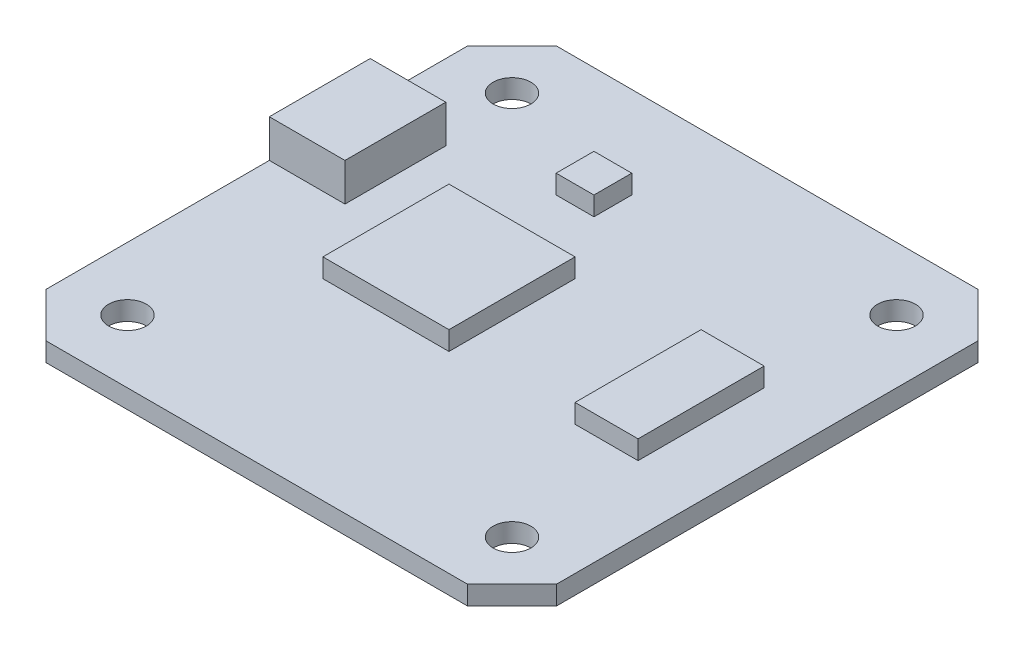
ISO-10303-21;
HEADER;
FILE_DESCRIPTION(('STEP AP214'),'2;1');
FILE_NAME('part.step','',(''),(''),'','','');
FILE_SCHEMA(('AUTOMOTIVE_DESIGN { 1 0 10303 214 1 1 1 1 }'));
ENDSEC;
DATA;
#1=APPLICATION_CONTEXT('core data for automotive mechanical design processes');
#2=APPLICATION_PROTOCOL_DEFINITION('international standard','automotive_design',2000,#1);
#3=PRODUCT_CONTEXT('',#1,'mechanical');
#4=PRODUCT('Part','Part','',(#3));
#5=PRODUCT_RELATED_PRODUCT_CATEGORY('part','',(#4));
#6=PRODUCT_DEFINITION_FORMATION('','',#4);
#7=PRODUCT_DEFINITION_CONTEXT('part definition',#1,'design');
#8=PRODUCT_DEFINITION('design','',#6,#7);
#9=PRODUCT_DEFINITION_SHAPE('','',#8);
#10=(LENGTH_UNIT() NAMED_UNIT(*) SI_UNIT(.MILLI.,.METRE.));
#11=(NAMED_UNIT(*) PLANE_ANGLE_UNIT() SI_UNIT($,.RADIAN.));
#12=(NAMED_UNIT(*) SI_UNIT($,.STERADIAN.) SOLID_ANGLE_UNIT());
#13=UNCERTAINTY_MEASURE_WITH_UNIT(LENGTH_MEASURE(1.E-05),#10,'distance_accuracy_value','');
#14=(GEOMETRIC_REPRESENTATION_CONTEXT(3) GLOBAL_UNCERTAINTY_ASSIGNED_CONTEXT((#13)) GLOBAL_UNIT_ASSIGNED_CONTEXT((#10,
#11,#12)) REPRESENTATION_CONTEXT('',''));
#15=CARTESIAN_POINT('',(0.,0.,0.));
#16=DIRECTION('',(0.,0.,1.));
#17=DIRECTION('',(1.,0.,0.));
#18=AXIS2_PLACEMENT_3D('',#15,#16,#17);
#19=CARTESIAN_POINT('',(0.,1.5,0.));
#20=DIRECTION('',(0.,1.,0.));
#21=DIRECTION('',(0.,0.,1.));
#22=AXIS2_PLACEMENT_3D('',#19,#20,#21);
#23=PLANE('',#22);
#24=CARTESIAN_POINT('',(15.25,1.5,15.25));
#25=DIRECTION('',(0.,1.,0.));
#26=DIRECTION('',(0.,0.,-1.));
#27=AXIS2_PLACEMENT_3D('',#24,#25,#26);
#28=CIRCLE('',#27,1.5);
#29=CARTESIAN_POINT('',(15.25,1.5,13.75));
#30=VERTEX_POINT('',#29);
#31=EDGE_CURVE('E315',#30,#30,#28,.T.);
#32=ORIENTED_EDGE('',*,*,#31,.F.);
#33=EDGE_LOOP('',(#32));
#34=FACE_BOUND('',#33,.T.);
#35=CARTESIAN_POINT('',(-15.25,1.5,-15.25));
#36=DIRECTION('',(0.,1.,0.));
#37=DIRECTION('',(0.,0.,1.));
#38=AXIS2_PLACEMENT_3D('',#35,#36,#37);
#39=CIRCLE('',#38,1.5);
#40=CARTESIAN_POINT('',(-15.25,1.5,-13.75));
#41=VERTEX_POINT('',#40);
#42=EDGE_CURVE('E327',#41,#41,#39,.T.);
#43=ORIENTED_EDGE('',*,*,#42,.F.);
#44=EDGE_LOOP('',(#43));
#45=FACE_BOUND('',#44,.T.);
#46=CARTESIAN_POINT('',(-15.25,1.5,15.25));
#47=DIRECTION('',(0.,1.,0.));
#48=DIRECTION('',(0.,0.,1.));
#49=AXIS2_PLACEMENT_3D('',#46,#47,#48);
#50=CIRCLE('',#49,1.5);
#51=CARTESIAN_POINT('',(-15.25,1.5,16.75));
#52=VERTEX_POINT('',#51);
#53=EDGE_CURVE('E321',#52,#52,#50,.T.);
#54=ORIENTED_EDGE('',*,*,#53,.F.);
#55=EDGE_LOOP('',(#54));
#56=FACE_BOUND('',#55,.T.);
#57=CARTESIAN_POINT('',(15.25,1.5,-15.25));
#58=DIRECTION('',(0.,1.,0.));
#59=DIRECTION('',(0.,0.,-1.));
#60=AXIS2_PLACEMENT_3D('',#57,#58,#59);
#61=CIRCLE('',#60,1.5);
#62=CARTESIAN_POINT('',(15.25,1.5,-16.75));
#63=VERTEX_POINT('',#62);
#64=EDGE_CURVE('E309',#63,#63,#61,.T.);
#65=ORIENTED_EDGE('',*,*,#64,.F.);
#66=EDGE_LOOP('',(#65));
#67=FACE_BOUND('',#66,.T.);
#68=DIRECTION('',(1.,0.,0.));
#69=VECTOR('',#68,1.);
#70=CARTESIAN_POINT('',(-10.,1.5,5.));
#71=LINE('',#70,#69);
#72=CARTESIAN_POINT('',(-10.,1.5,5.));
#73=VERTEX_POINT('',#72);
#74=CARTESIAN_POINT('',(0.,1.5,5.));
#75=VERTEX_POINT('',#74);
#76=EDGE_CURVE('E293',#73,#75,#71,.T.);
#77=ORIENTED_EDGE('',*,*,#76,.F.);
#78=DIRECTION('',(0.,0.,1.));
#79=VECTOR('',#78,1.);
#80=CARTESIAN_POINT('',(-10.,1.5,-5.));
#81=LINE('',#80,#79);
#82=CARTESIAN_POINT('',(-10.,1.5,-5.));
#83=VERTEX_POINT('',#82);
#84=EDGE_CURVE('E279',#83,#73,#81,.T.);
#85=ORIENTED_EDGE('',*,*,#84,.F.);
#86=DIRECTION('',(-1.,0.,0.));
#87=VECTOR('',#86,1.);
#88=CARTESIAN_POINT('',(-10.,1.5,-5.));
#89=LINE('',#88,#87);
#90=CARTESIAN_POINT('',(0.,1.5,-5.));
#91=VERTEX_POINT('',#90);
#92=EDGE_CURVE('E284',#91,#83,#89,.T.);
#93=ORIENTED_EDGE('',*,*,#92,.F.);
#94=DIRECTION('',(0.,0.,-1.));
#95=VECTOR('',#94,1.);
#96=CARTESIAN_POINT('',(0.,1.5,-5.));
#97=LINE('',#96,#95);
#98=EDGE_CURVE('E295',#75,#91,#97,.T.);
#99=ORIENTED_EDGE('',*,*,#98,.F.);
#100=EDGE_LOOP('',(#77,#85,#93,#99));
#101=FACE_BOUND('',#100,.T.);
#102=DIRECTION('',(1.,0.,0.));
#103=VECTOR('',#102,1.);
#104=CARTESIAN_POINT('',(10.,1.5,5.));
#105=LINE('',#104,#103);
#106=CARTESIAN_POINT('',(10.,1.5,5.));
#107=VERTEX_POINT('',#106);
#108=CARTESIAN_POINT('',(15.,1.5,5.));
#109=VERTEX_POINT('',#108);
#110=EDGE_CURVE('E264',#107,#109,#105,.T.);
#111=ORIENTED_EDGE('',*,*,#110,.F.);
#112=DIRECTION('',(0.,0.,1.));
#113=VECTOR('',#112,1.);
#114=CARTESIAN_POINT('',(10.,1.5,-5.));
#115=LINE('',#114,#113);
#116=CARTESIAN_POINT('',(10.,1.5,-5.));
#117=VERTEX_POINT('',#116);
#118=EDGE_CURVE('E250',#117,#107,#115,.T.);
#119=ORIENTED_EDGE('',*,*,#118,.F.);
#120=DIRECTION('',(-1.,0.,0.));
#121=VECTOR('',#120,1.);
#122=CARTESIAN_POINT('',(10.,1.5,-5.));
#123=LINE('',#122,#121);
#124=CARTESIAN_POINT('',(15.,1.5,-5.));
#125=VERTEX_POINT('',#124);
#126=EDGE_CURVE('E255',#125,#117,#123,.T.);
#127=ORIENTED_EDGE('',*,*,#126,.F.);
#128=DIRECTION('',(0.,0.,-1.));
#129=VECTOR('',#128,1.);
#130=CARTESIAN_POINT('',(15.,1.5,-5.));
#131=LINE('',#130,#129);
#132=EDGE_CURVE('E266',#109,#125,#131,.T.);
#133=ORIENTED_EDGE('',*,*,#132,.F.);
#134=EDGE_LOOP('',(#111,#119,#127,#133));
#135=FACE_BOUND('',#134,.T.);
#136=DIRECTION('',(1.,0.,0.));
#137=VECTOR('',#136,1.);
#138=CARTESIAN_POINT('',(-6.5,1.5,-10.));
#139=LINE('',#138,#137);
#140=CARTESIAN_POINT('',(-6.5,1.5,-10.));
#141=VERTEX_POINT('',#140);
#142=CARTESIAN_POINT('',(-3.5,1.5,-10.));
#143=VERTEX_POINT('',#142);
#144=EDGE_CURVE('E219',#141,#143,#139,.T.);
#145=ORIENTED_EDGE('',*,*,#144,.F.);
#146=DIRECTION('',(0.,0.,1.));
#147=VECTOR('',#146,1.);
#148=CARTESIAN_POINT('',(-6.5,1.5,-13.));
#149=LINE('',#148,#147);
#150=CARTESIAN_POINT('',(-6.5,1.5,-13.));
#151=VERTEX_POINT('',#150);
#152=EDGE_CURVE('E216',#151,#141,#149,.T.);
#153=ORIENTED_EDGE('',*,*,#152,.F.);
#154=DIRECTION('',(-1.,0.,0.));
#155=VECTOR('',#154,1.);
#156=CARTESIAN_POINT('',(-6.5,1.5,-13.));
#157=LINE('',#156,#155);
#158=CARTESIAN_POINT('',(-3.5,1.5,-13.));
#159=VERTEX_POINT('',#158);
#160=EDGE_CURVE('E229',#159,#151,#157,.T.);
#161=ORIENTED_EDGE('',*,*,#160,.F.);
#162=DIRECTION('',(0.,0.,-1.));
#163=VECTOR('',#162,1.);
#164=CARTESIAN_POINT('',(-3.5,1.5,-13.));
#165=LINE('',#164,#163);
#166=EDGE_CURVE('E237',#143,#159,#165,.T.);
#167=ORIENTED_EDGE('',*,*,#166,.F.);
#168=EDGE_LOOP('',(#145,#153,#161,#167));
#169=FACE_BOUND('',#168,.T.);
#170=DIRECTION('',(0.,0.,-1.));
#171=VECTOR('',#170,1.);
#172=CARTESIAN_POINT('',(-14.25,1.5,-9.));
#173=LINE('',#172,#171);
#174=CARTESIAN_POINT('',(-14.25,1.5,-1.));
#175=VERTEX_POINT('',#174);
#176=CARTESIAN_POINT('',(-14.25,1.5,-9.));
#177=VERTEX_POINT('',#176);
#178=EDGE_CURVE('E48',#175,#177,#173,.T.);
#179=ORIENTED_EDGE('',*,*,#178,.F.);
#180=DIRECTION('',(1.,0.,0.));
#181=VECTOR('',#180,1.);
#182=CARTESIAN_POINT('',(-20.25,1.5,-1.));
#183=LINE('',#182,#181);
#184=CARTESIAN_POINT('',(-20.25,1.5,-1.));
#185=VERTEX_POINT('',#184);
#186=EDGE_CURVE('E406',#185,#175,#183,.T.);
#187=ORIENTED_EDGE('',*,*,#186,.F.);
#188=DIRECTION('',(0.,0.,1.));
#189=VECTOR('',#188,1.);
#190=CARTESIAN_POINT('',(-20.25,1.5,-16.7144660940673));
#191=LINE('',#190,#189);
#192=CARTESIAN_POINT('',(-20.25,1.5,16.7144660940673));
#193=VERTEX_POINT('',#192);
#194=EDGE_CURVE('E215',#185,#193,#191,.T.);
#195=ORIENTED_EDGE('',*,*,#194,.T.);
#196=DIRECTION('',(0.707106781186546,0.,0.707106781186549));
#197=VECTOR('',#196,1.);
#198=CARTESIAN_POINT('',(-20.25,1.5,16.7144660940673));
#199=LINE('',#198,#197);
#200=CARTESIAN_POINT('',(-16.7144660940673,1.5,20.25));
#201=VERTEX_POINT('',#200);
#202=EDGE_CURVE('E339',#193,#201,#199,.T.);
#203=ORIENTED_EDGE('',*,*,#202,.T.);
#204=DIRECTION('',(1.,0.,0.));
#205=VECTOR('',#204,1.);
#206=CARTESIAN_POINT('',(-16.7144660940673,1.5,20.25));
#207=LINE('',#206,#205);
#208=CARTESIAN_POINT('',(16.7144660940673,1.5,20.25));
#209=VERTEX_POINT('',#208);
#210=EDGE_CURVE('E341',#201,#209,#207,.T.);
#211=ORIENTED_EDGE('',*,*,#210,.T.);
#212=DIRECTION('',(0.707106781186546,0.,-0.707106781186549));
#213=VECTOR('',#212,1.);
#214=CARTESIAN_POINT('',(20.25,1.5,16.7144660940673));
#215=LINE('',#214,#213);
#216=CARTESIAN_POINT('',(20.25,1.5,16.7144660940673));
#217=VERTEX_POINT('',#216);
#218=EDGE_CURVE('E343',#209,#217,#215,.T.);
#219=ORIENTED_EDGE('',*,*,#218,.T.);
#220=DIRECTION('',(0.,0.,-1.));
#221=VECTOR('',#220,1.);
#222=CARTESIAN_POINT('',(20.25,1.5,-16.7144660940673));
#223=LINE('',#222,#221);
#224=CARTESIAN_POINT('',(20.25,1.5,-16.7144660940673));
#225=VERTEX_POINT('',#224);
#226=EDGE_CURVE('E345',#217,#225,#223,.T.);
#227=ORIENTED_EDGE('',*,*,#226,.T.);
#228=DIRECTION('',(-0.707106781186546,0.,-0.707106781186549));
#229=VECTOR('',#228,1.);
#230=CARTESIAN_POINT('',(16.7144660940673,1.5,-20.25));
#231=LINE('',#230,#229);
#232=CARTESIAN_POINT('',(16.7144660940673,1.5,-20.25));
#233=VERTEX_POINT('',#232);
#234=EDGE_CURVE('E347',#225,#233,#231,.T.);
#235=ORIENTED_EDGE('',*,*,#234,.T.);
#236=DIRECTION('',(-1.,0.,0.));
#237=VECTOR('',#236,1.);
#238=CARTESIAN_POINT('',(16.7144660940673,1.5,-20.25));
#239=LINE('',#238,#237);
#240=CARTESIAN_POINT('',(-16.7144660940673,1.5,-20.25));
#241=VERTEX_POINT('',#240);
#242=EDGE_CURVE('E349',#233,#241,#239,.T.);
#243=ORIENTED_EDGE('',*,*,#242,.T.);
#244=DIRECTION('',(-0.707106781186546,0.,0.707106781186549));
#245=VECTOR('',#244,1.);
#246=CARTESIAN_POINT('',(-16.7144660940673,1.5,-20.25));
#247=LINE('',#246,#245);
#248=CARTESIAN_POINT('',(-20.25,1.5,-16.7144660940673));
#249=VERTEX_POINT('',#248);
#250=EDGE_CURVE('E333',#241,#249,#247,.T.);
#251=ORIENTED_EDGE('',*,*,#250,.T.);
#252=CARTESIAN_POINT('',(-20.25,1.5,-9.));
#253=VERTEX_POINT('',#252);
#254=EDGE_CURVE('E337',#249,#253,#191,.T.);
#255=ORIENTED_EDGE('',*,*,#254,.T.);
#256=DIRECTION('',(-1.,0.,0.));
#257=VECTOR('',#256,1.);
#258=CARTESIAN_POINT('',(-20.25,1.5,-9.));
#259=LINE('',#258,#257);
#260=EDGE_CURVE('E53',#177,#253,#259,.T.);
#261=ORIENTED_EDGE('',*,*,#260,.F.);
#262=EDGE_LOOP('',(#179,#187,#195,#203,#211,#219,#227,#235,#243,#251,#255,#261));
#263=FACE_BOUND('',#262,.T.);
#264=ADVANCED_FACE('F33',(#34,#45,#56,#67,#101,#135,#169,#263),#23,.T.);
#265=CARTESIAN_POINT('',(0.,0.,0.));
#266=DIRECTION('',(0.,1.,0.));
#267=DIRECTION('',(0.,0.,1.));
#268=AXIS2_PLACEMENT_3D('',#265,#266,#267);
#269=PLANE('',#268);
#270=DIRECTION('',(-0.707106781186546,0.,0.707106781186549));
#271=VECTOR('',#270,1.);
#272=CARTESIAN_POINT('',(-16.7144660940673,0.,-20.25));
#273=LINE('',#272,#271);
#274=CARTESIAN_POINT('',(-16.7144660940673,0.,-20.25));
#275=VERTEX_POINT('',#274);
#276=CARTESIAN_POINT('',(-20.25,0.,-16.7144660940673));
#277=VERTEX_POINT('',#276);
#278=EDGE_CURVE('E330',#275,#277,#273,.T.);
#279=ORIENTED_EDGE('',*,*,#278,.F.);
#280=DIRECTION('',(-1.,0.,0.));
#281=VECTOR('',#280,1.);
#282=CARTESIAN_POINT('',(16.7144660940673,0.,-20.25));
#283=LINE('',#282,#281);
#284=CARTESIAN_POINT('',(16.7144660940673,0.,-20.25));
#285=VERTEX_POINT('',#284);
#286=EDGE_CURVE('E336',#285,#275,#283,.T.);
#287=ORIENTED_EDGE('',*,*,#286,.F.);
#288=DIRECTION('',(-0.707106781186546,0.,-0.707106781186549));
#289=VECTOR('',#288,1.);
#290=CARTESIAN_POINT('',(16.7144660940673,0.,-20.25));
#291=LINE('',#290,#289);
#292=CARTESIAN_POINT('',(20.25,0.,-16.7144660940673));
#293=VERTEX_POINT('',#292);
#294=EDGE_CURVE('E364',#293,#285,#291,.T.);
#295=ORIENTED_EDGE('',*,*,#294,.F.);
#296=DIRECTION('',(0.,0.,-1.));
#297=VECTOR('',#296,1.);
#298=CARTESIAN_POINT('',(20.25,0.,-16.7144660940673));
#299=LINE('',#298,#297);
#300=CARTESIAN_POINT('',(20.25,0.,16.7144660940673));
#301=VERTEX_POINT('',#300);
#302=EDGE_CURVE('E362',#301,#293,#299,.T.);
#303=ORIENTED_EDGE('',*,*,#302,.F.);
#304=DIRECTION('',(0.707106781186546,0.,-0.707106781186549));
#305=VECTOR('',#304,1.);
#306=CARTESIAN_POINT('',(20.25,0.,16.7144660940673));
#307=LINE('',#306,#305);
#308=CARTESIAN_POINT('',(16.7144660940673,0.,20.25));
#309=VERTEX_POINT('',#308);
#310=EDGE_CURVE('E360',#309,#301,#307,.T.);
#311=ORIENTED_EDGE('',*,*,#310,.F.);
#312=DIRECTION('',(1.,0.,0.));
#313=VECTOR('',#312,1.);
#314=CARTESIAN_POINT('',(-16.7144660940673,0.,20.25));
#315=LINE('',#314,#313);
#316=CARTESIAN_POINT('',(-16.7144660940673,0.,20.25));
#317=VERTEX_POINT('',#316);
#318=EDGE_CURVE('E358',#317,#309,#315,.T.);
#319=ORIENTED_EDGE('',*,*,#318,.F.);
#320=DIRECTION('',(0.707106781186546,0.,0.707106781186549));
#321=VECTOR('',#320,1.);
#322=CARTESIAN_POINT('',(-20.25,0.,16.7144660940673));
#323=LINE('',#322,#321);
#324=CARTESIAN_POINT('',(-20.25,0.,16.7144660940673));
#325=VERTEX_POINT('',#324);
#326=EDGE_CURVE('E356',#325,#317,#323,.T.);
#327=ORIENTED_EDGE('',*,*,#326,.F.);
#328=DIRECTION('',(0.,0.,1.));
#329=VECTOR('',#328,1.);
#330=CARTESIAN_POINT('',(-20.25,0.,-16.7144660940673));
#331=LINE('',#330,#329);
#332=EDGE_CURVE('E354',#277,#325,#331,.T.);
#333=ORIENTED_EDGE('',*,*,#332,.F.);
#334=EDGE_LOOP('',(#279,#287,#295,#303,#311,#319,#327,#333));
#335=FACE_BOUND('',#334,.T.);
#336=CARTESIAN_POINT('',(-15.25,0.,-15.25));
#337=DIRECTION('',(0.,1.,0.));
#338=DIRECTION('',(0.,0.,1.));
#339=AXIS2_PLACEMENT_3D('',#336,#337,#338);
#340=CIRCLE('',#339,1.5);
#341=CARTESIAN_POINT('',(-15.25,0.,-13.75));
#342=VERTEX_POINT('',#341);
#343=EDGE_CURVE('E324',#342,#342,#340,.T.);
#344=ORIENTED_EDGE('',*,*,#343,.T.);
#345=EDGE_LOOP('',(#344));
#346=FACE_BOUND('',#345,.T.);
#347=CARTESIAN_POINT('',(-15.25,0.,15.25));
#348=DIRECTION('',(0.,1.,0.));
#349=DIRECTION('',(0.,0.,1.));
#350=AXIS2_PLACEMENT_3D('',#347,#348,#349);
#351=CIRCLE('',#350,1.5);
#352=CARTESIAN_POINT('',(-15.25,0.,16.75));
#353=VERTEX_POINT('',#352);
#354=EDGE_CURVE('E318',#353,#353,#351,.T.);
#355=ORIENTED_EDGE('',*,*,#354,.T.);
#356=EDGE_LOOP('',(#355));
#357=FACE_BOUND('',#356,.T.);
#358=CARTESIAN_POINT('',(15.25,0.,15.25));
#359=DIRECTION('',(0.,1.,0.));
#360=DIRECTION('',(0.,0.,-1.));
#361=AXIS2_PLACEMENT_3D('',#358,#359,#360);
#362=CIRCLE('',#361,1.5);
#363=CARTESIAN_POINT('',(15.25,0.,13.75));
#364=VERTEX_POINT('',#363);
#365=EDGE_CURVE('E312',#364,#364,#362,.T.);
#366=ORIENTED_EDGE('',*,*,#365,.T.);
#367=EDGE_LOOP('',(#366));
#368=FACE_BOUND('',#367,.T.);
#369=CARTESIAN_POINT('',(15.25,0.,-15.25));
#370=DIRECTION('',(0.,1.,0.));
#371=DIRECTION('',(0.,0.,-1.));
#372=AXIS2_PLACEMENT_3D('',#369,#370,#371);
#373=CIRCLE('',#372,1.5);
#374=CARTESIAN_POINT('',(15.25,0.,-16.75));
#375=VERTEX_POINT('',#374);
#376=EDGE_CURVE('E308',#375,#375,#373,.T.);
#377=ORIENTED_EDGE('',*,*,#376,.T.);
#378=EDGE_LOOP('',(#377));
#379=FACE_BOUND('',#378,.T.);
#380=ADVANCED_FACE('F392',(#335,#346,#357,#368,#379),#269,.F.);
#381=CARTESIAN_POINT('',(-16.7144660940673,1.5,-20.25));
#382=DIRECTION('',(0.707106781186549,0.,0.707106781186546));
#383=DIRECTION('',(0.707106781186546,0.,-0.707106781186549));
#384=AXIS2_PLACEMENT_3D('',#381,#382,#383);
#385=PLANE('',#384);
#386=ORIENTED_EDGE('',*,*,#278,.T.);
#387=DIRECTION('',(0.,-1.,0.));
#388=VECTOR('',#387,1.);
#389=CARTESIAN_POINT('',(-20.25,1.5,-16.7144660940673));
#390=LINE('',#389,#388);
#391=EDGE_CURVE('E11',#249,#277,#390,.T.);
#392=ORIENTED_EDGE('',*,*,#391,.F.);
#393=ORIENTED_EDGE('',*,*,#250,.F.);
#394=DIRECTION('',(0.,-1.,0.));
#395=VECTOR('',#394,1.);
#396=CARTESIAN_POINT('',(-16.7144660940673,1.5,-20.25));
#397=LINE('',#396,#395);
#398=EDGE_CURVE('E351',#241,#275,#397,.T.);
#399=ORIENTED_EDGE('',*,*,#398,.T.);
#400=EDGE_LOOP('',(#386,#392,#393,#399));
#401=FACE_BOUND('',#400,.T.);
#402=ADVANCED_FACE('F35',(#401),#385,.F.);
#403=CARTESIAN_POINT('',(-20.25,1.5,-16.7144660940673));
#404=DIRECTION('',(1.,0.,0.));
#405=DIRECTION('',(0.,0.,-1.));
#406=AXIS2_PLACEMENT_3D('',#403,#404,#405);
#407=PLANE('',#406);
#408=ORIENTED_EDGE('',*,*,#332,.T.);
#409=DIRECTION('',(0.,-1.,0.));
#410=VECTOR('',#409,1.);
#411=CARTESIAN_POINT('',(-20.25,1.5,16.7144660940673));
#412=LINE('',#411,#410);
#413=EDGE_CURVE('E41',#193,#325,#412,.T.);
#414=ORIENTED_EDGE('',*,*,#413,.F.);
#415=ORIENTED_EDGE('',*,*,#194,.F.);
#416=DIRECTION('',(0.,-1.,0.));
#417=VECTOR('',#416,1.);
#418=CARTESIAN_POINT('',(-20.25,4.5,-1.));
#419=LINE('',#418,#417);
#420=CARTESIAN_POINT('',(-20.25,4.5,-1.));
#421=VERTEX_POINT('',#420);
#422=EDGE_CURVE('E197',#421,#185,#419,.T.);
#423=ORIENTED_EDGE('',*,*,#422,.F.);
#424=DIRECTION('',(0.,0.,1.));
#425=VECTOR('',#424,1.);
#426=CARTESIAN_POINT('',(-20.25,4.5,-9.));
#427=LINE('',#426,#425);
#428=CARTESIAN_POINT('',(-20.25,4.5,-9.));
#429=VERTEX_POINT('',#428);
#430=EDGE_CURVE('E203',#429,#421,#427,.T.);
#431=ORIENTED_EDGE('',*,*,#430,.F.);
#432=DIRECTION('',(0.,-1.,0.));
#433=VECTOR('',#432,1.);
#434=CARTESIAN_POINT('',(-20.25,4.5,-9.));
#435=LINE('',#434,#433);
#436=EDGE_CURVE('E413',#429,#253,#435,.T.);
#437=ORIENTED_EDGE('',*,*,#436,.T.);
#438=ORIENTED_EDGE('',*,*,#254,.F.);
#439=ORIENTED_EDGE('',*,*,#391,.T.);
#440=EDGE_LOOP('',(#408,#414,#415,#423,#431,#437,#438,#439));
#441=FACE_BOUND('',#440,.T.);
#442=ADVANCED_FACE('F213',(#441),#407,.F.);
#443=CARTESIAN_POINT('',(-20.25,1.5,16.7144660940673));
#444=DIRECTION('',(0.707106781186549,0.,-0.707106781186546));
#445=DIRECTION('',(-0.707106781186546,0.,-0.707106781186549));
#446=AXIS2_PLACEMENT_3D('',#443,#444,#445);
#447=PLANE('',#446);
#448=ORIENTED_EDGE('',*,*,#326,.T.);
#449=DIRECTION('',(0.,-1.,0.));
#450=VECTOR('',#449,1.);
#451=CARTESIAN_POINT('',(-16.7144660940673,1.5,20.25));
#452=LINE('',#451,#450);
#453=EDGE_CURVE('E381',#201,#317,#452,.T.);
#454=ORIENTED_EDGE('',*,*,#453,.F.);
#455=ORIENTED_EDGE('',*,*,#202,.F.);
#456=ORIENTED_EDGE('',*,*,#413,.T.);
#457=EDGE_LOOP('',(#448,#454,#455,#456));
#458=FACE_BOUND('',#457,.T.);
#459=ADVANCED_FACE('F387',(#458),#447,.F.);
#460=CARTESIAN_POINT('',(-16.7144660940673,1.5,20.25));
#461=DIRECTION('',(0.,0.,-1.));
#462=DIRECTION('',(-1.,0.,0.));
#463=AXIS2_PLACEMENT_3D('',#460,#461,#462);
#464=PLANE('',#463);
#465=ORIENTED_EDGE('',*,*,#318,.T.);
#466=DIRECTION('',(0.,-1.,0.));
#467=VECTOR('',#466,1.);
#468=CARTESIAN_POINT('',(16.7144660940673,1.5,20.25));
#469=LINE('',#468,#467);
#470=EDGE_CURVE('E378',#209,#309,#469,.T.);
#471=ORIENTED_EDGE('',*,*,#470,.F.);
#472=ORIENTED_EDGE('',*,*,#210,.F.);
#473=ORIENTED_EDGE('',*,*,#453,.T.);
#474=EDGE_LOOP('',(#465,#471,#472,#473));
#475=FACE_BOUND('',#474,.T.);
#476=ADVANCED_FACE('F398',(#475),#464,.F.);
#477=CARTESIAN_POINT('',(20.25,1.5,16.7144660940673));
#478=DIRECTION('',(-0.707106781186549,0.,-0.707106781186546));
#479=DIRECTION('',(-0.707106781186546,0.,0.707106781186549));
#480=AXIS2_PLACEMENT_3D('',#477,#478,#479);
#481=PLANE('',#480);
#482=ORIENTED_EDGE('',*,*,#310,.T.);
#483=DIRECTION('',(0.,-1.,0.));
#484=VECTOR('',#483,1.);
#485=CARTESIAN_POINT('',(20.25,1.5,16.7144660940673));
#486=LINE('',#485,#484);
#487=EDGE_CURVE('E375',#217,#301,#486,.T.);
#488=ORIENTED_EDGE('',*,*,#487,.F.);
#489=ORIENTED_EDGE('',*,*,#218,.F.);
#490=ORIENTED_EDGE('',*,*,#470,.T.);
#491=EDGE_LOOP('',(#482,#488,#489,#490));
#492=FACE_BOUND('',#491,.T.);
#493=ADVANCED_FACE('F402',(#492),#481,.F.);
#494=CARTESIAN_POINT('',(20.25,1.5,-16.7144660940673));
#495=DIRECTION('',(-1.,0.,0.));
#496=DIRECTION('',(0.,0.,1.));
#497=AXIS2_PLACEMENT_3D('',#494,#495,#496);
#498=PLANE('',#497);
#499=ORIENTED_EDGE('',*,*,#302,.T.);
#500=DIRECTION('',(0.,-1.,0.));
#501=VECTOR('',#500,1.);
#502=CARTESIAN_POINT('',(20.25,1.5,-16.7144660940673));
#503=LINE('',#502,#501);
#504=EDGE_CURVE('E372',#225,#293,#503,.T.);
#505=ORIENTED_EDGE('',*,*,#504,.F.);
#506=ORIENTED_EDGE('',*,*,#226,.F.);
#507=ORIENTED_EDGE('',*,*,#487,.T.);
#508=EDGE_LOOP('',(#499,#505,#506,#507));
#509=FACE_BOUND('',#508,.T.);
#510=ADVANCED_FACE('F449',(#509),#498,.F.);
#511=CARTESIAN_POINT('',(16.7144660940673,1.5,-20.25));
#512=DIRECTION('',(-0.707106781186549,0.,0.707106781186546));
#513=DIRECTION('',(0.707106781186546,0.,0.707106781186549));
#514=AXIS2_PLACEMENT_3D('',#511,#512,#513);
#515=PLANE('',#514);
#516=ORIENTED_EDGE('',*,*,#294,.T.);
#517=DIRECTION('',(0.,-1.,0.));
#518=VECTOR('',#517,1.);
#519=CARTESIAN_POINT('',(16.7144660940673,1.5,-20.25));
#520=LINE('',#519,#518);
#521=EDGE_CURVE('E369',#233,#285,#520,.T.);
#522=ORIENTED_EDGE('',*,*,#521,.F.);
#523=ORIENTED_EDGE('',*,*,#234,.F.);
#524=ORIENTED_EDGE('',*,*,#504,.T.);
#525=EDGE_LOOP('',(#516,#522,#523,#524));
#526=FACE_BOUND('',#525,.T.);
#527=ADVANCED_FACE('F445',(#526),#515,.F.);
#528=CARTESIAN_POINT('',(16.7144660940673,1.5,-20.25));
#529=DIRECTION('',(0.,0.,1.));
#530=DIRECTION('',(1.,0.,0.));
#531=AXIS2_PLACEMENT_3D('',#528,#529,#530);
#532=PLANE('',#531);
#533=ORIENTED_EDGE('',*,*,#286,.T.);
#534=ORIENTED_EDGE('',*,*,#398,.F.);
#535=ORIENTED_EDGE('',*,*,#242,.F.);
#536=ORIENTED_EDGE('',*,*,#521,.T.);
#537=EDGE_LOOP('',(#533,#534,#535,#536));
#538=FACE_BOUND('',#537,.T.);
#539=ADVANCED_FACE('F442',(#538),#532,.F.);
#540=CARTESIAN_POINT('',(-15.25,1.5,-15.25));
#541=DIRECTION('',(0.,-1.,0.));
#542=DIRECTION('',(0.,0.,-1.));
#543=AXIS2_PLACEMENT_3D('',#540,#541,#542);
#544=CYLINDRICAL_SURFACE('',#543,1.5);
#545=ORIENTED_EDGE('',*,*,#42,.T.);
#546=EDGE_LOOP('',(#545));
#547=FACE_BOUND('',#546,.T.);
#548=ORIENTED_EDGE('',*,*,#343,.F.);
#549=EDGE_LOOP('',(#548));
#550=FACE_BOUND('',#549,.T.);
#551=ADVANCED_FACE('F439',(#547,#550),#544,.F.);
#552=CARTESIAN_POINT('',(-15.25,1.5,15.25));
#553=DIRECTION('',(0.,-1.,0.));
#554=DIRECTION('',(0.,0.,-1.));
#555=AXIS2_PLACEMENT_3D('',#552,#553,#554);
#556=CYLINDRICAL_SURFACE('',#555,1.5);
#557=ORIENTED_EDGE('',*,*,#53,.T.);
#558=EDGE_LOOP('',(#557));
#559=FACE_BOUND('',#558,.T.);
#560=ORIENTED_EDGE('',*,*,#354,.F.);
#561=EDGE_LOOP('',(#560));
#562=FACE_BOUND('',#561,.T.);
#563=ADVANCED_FACE('F528',(#559,#562),#556,.F.);
#564=CARTESIAN_POINT('',(15.25,1.5,15.25));
#565=DIRECTION('',(0.,-1.,0.));
#566=DIRECTION('',(0.,0.,-1.));
#567=AXIS2_PLACEMENT_3D('',#564,#565,#566);
#568=CYLINDRICAL_SURFACE('',#567,1.5);
#569=ORIENTED_EDGE('',*,*,#31,.T.);
#570=EDGE_LOOP('',(#569));
#571=FACE_BOUND('',#570,.T.);
#572=ORIENTED_EDGE('',*,*,#365,.F.);
#573=EDGE_LOOP('',(#572));
#574=FACE_BOUND('',#573,.T.);
#575=ADVANCED_FACE('F536',(#571,#574),#568,.F.);
#576=CARTESIAN_POINT('',(15.25,1.5,-15.25));
#577=DIRECTION('',(0.,-1.,0.));
#578=DIRECTION('',(0.,0.,-1.));
#579=AXIS2_PLACEMENT_3D('',#576,#577,#578);
#580=CYLINDRICAL_SURFACE('',#579,1.5);
#581=ORIENTED_EDGE('',*,*,#64,.T.);
#582=EDGE_LOOP('',(#581));
#583=FACE_BOUND('',#582,.T.);
#584=ORIENTED_EDGE('',*,*,#376,.F.);
#585=EDGE_LOOP('',(#584));
#586=FACE_BOUND('',#585,.T.);
#587=ADVANCED_FACE('F544',(#583,#586),#580,.F.);
#588=CARTESIAN_POINT('',(-10.,3.,-5.));
#589=DIRECTION('',(1.,0.,0.));
#590=DIRECTION('',(0.,0.,-1.));
#591=AXIS2_PLACEMENT_3D('',#588,#589,#590);
#592=PLANE('',#591);
#593=ORIENTED_EDGE('',*,*,#84,.T.);
#594=DIRECTION('',(0.,-1.,0.));
#595=VECTOR('',#594,1.);
#596=CARTESIAN_POINT('',(-10.,3.,5.));
#597=LINE('',#596,#595);
#598=CARTESIAN_POINT('',(-10.,3.,5.));
#599=VERTEX_POINT('',#598);
#600=EDGE_CURVE('E306',#599,#73,#597,.T.);
#601=ORIENTED_EDGE('',*,*,#600,.F.);
#602=DIRECTION('',(0.,0.,1.));
#603=VECTOR('',#602,1.);
#604=CARTESIAN_POINT('',(-10.,3.,-5.));
#605=LINE('',#604,#603);
#606=CARTESIAN_POINT('',(-10.,3.,-5.));
#607=VERTEX_POINT('',#606);
#608=EDGE_CURVE('E280',#607,#599,#605,.T.);
#609=ORIENTED_EDGE('',*,*,#608,.F.);
#610=DIRECTION('',(0.,-1.,0.));
#611=VECTOR('',#610,1.);
#612=CARTESIAN_POINT('',(-10.,3.,-5.));
#613=LINE('',#612,#611);
#614=EDGE_CURVE('E290',#607,#83,#613,.T.);
#615=ORIENTED_EDGE('',*,*,#614,.T.);
#616=EDGE_LOOP('',(#593,#601,#609,#615));
#617=FACE_BOUND('',#616,.T.);
#618=ADVANCED_FACE('F553',(#617),#592,.F.);
#619=CARTESIAN_POINT('',(-10.,3.,5.));
#620=DIRECTION('',(0.,0.,-1.));
#621=DIRECTION('',(-1.,0.,0.));
#622=AXIS2_PLACEMENT_3D('',#619,#620,#621);
#623=PLANE('',#622);
#624=ORIENTED_EDGE('',*,*,#76,.T.);
#625=DIRECTION('',(0.,-1.,0.));
#626=VECTOR('',#625,1.);
#627=CARTESIAN_POINT('',(0.,3.,5.));
#628=LINE('',#627,#626);
#629=CARTESIAN_POINT('',(0.,3.,5.));
#630=VERTEX_POINT('',#629);
#631=EDGE_CURVE('E303',#630,#75,#628,.T.);
#632=ORIENTED_EDGE('',*,*,#631,.F.);
#633=DIRECTION('',(1.,0.,0.));
#634=VECTOR('',#633,1.);
#635=CARTESIAN_POINT('',(-10.,3.,5.));
#636=LINE('',#635,#634);
#637=EDGE_CURVE('E283',#599,#630,#636,.T.);
#638=ORIENTED_EDGE('',*,*,#637,.F.);
#639=ORIENTED_EDGE('',*,*,#600,.T.);
#640=EDGE_LOOP('',(#624,#632,#638,#639));
#641=FACE_BOUND('',#640,.T.);
#642=ADVANCED_FACE('F562',(#641),#623,.F.);
#643=CARTESIAN_POINT('',(0.,3.,-5.));
#644=DIRECTION('',(-1.,0.,0.));
#645=DIRECTION('',(0.,0.,1.));
#646=AXIS2_PLACEMENT_3D('',#643,#644,#645);
#647=PLANE('',#646);
#648=ORIENTED_EDGE('',*,*,#98,.T.);
#649=DIRECTION('',(0.,-1.,0.));
#650=VECTOR('',#649,1.);
#651=CARTESIAN_POINT('',(0.,3.,-5.));
#652=LINE('',#651,#650);
#653=CARTESIAN_POINT('',(0.,3.,-5.));
#654=VERTEX_POINT('',#653);
#655=EDGE_CURVE('E301',#654,#91,#652,.T.);
#656=ORIENTED_EDGE('',*,*,#655,.F.);
#657=DIRECTION('',(0.,0.,-1.));
#658=VECTOR('',#657,1.);
#659=CARTESIAN_POINT('',(0.,3.,-5.));
#660=LINE('',#659,#658);
#661=EDGE_CURVE('E286',#630,#654,#660,.T.);
#662=ORIENTED_EDGE('',*,*,#661,.F.);
#663=ORIENTED_EDGE('',*,*,#631,.T.);
#664=EDGE_LOOP('',(#648,#656,#662,#663));
#665=FACE_BOUND('',#664,.T.);
#666=ADVANCED_FACE('F571',(#665),#647,.F.);
#667=CARTESIAN_POINT('',(-10.,3.,-5.));
#668=DIRECTION('',(0.,0.,1.));
#669=DIRECTION('',(1.,0.,0.));
#670=AXIS2_PLACEMENT_3D('',#667,#668,#669);
#671=PLANE('',#670);
#672=ORIENTED_EDGE('',*,*,#92,.T.);
#673=ORIENTED_EDGE('',*,*,#614,.F.);
#674=DIRECTION('',(-1.,0.,0.));
#675=VECTOR('',#674,1.);
#676=CARTESIAN_POINT('',(-10.,3.,-5.));
#677=LINE('',#676,#675);
#678=EDGE_CURVE('E288',#654,#607,#677,.T.);
#679=ORIENTED_EDGE('',*,*,#678,.F.);
#680=ORIENTED_EDGE('',*,*,#655,.T.);
#681=EDGE_LOOP('',(#672,#673,#679,#680));
#682=FACE_BOUND('',#681,.T.);
#683=ADVANCED_FACE('F580',(#682),#671,.F.);
#684=CARTESIAN_POINT('',(0.,3.,0.));
#685=DIRECTION('',(0.,1.,0.));
#686=DIRECTION('',(0.,0.,1.));
#687=AXIS2_PLACEMENT_3D('',#684,#685,#686);
#688=PLANE('',#687);
#689=ORIENTED_EDGE('',*,*,#608,.T.);
#690=ORIENTED_EDGE('',*,*,#637,.T.);
#691=ORIENTED_EDGE('',*,*,#661,.T.);
#692=ORIENTED_EDGE('',*,*,#678,.T.);
#693=EDGE_LOOP('',(#689,#690,#691,#692));
#694=FACE_BOUND('',#693,.T.);
#695=ADVANCED_FACE('F589',(#694),#688,.T.);
#696=CARTESIAN_POINT('',(10.,3.,-5.));
#697=DIRECTION('',(1.,0.,0.));
#698=DIRECTION('',(0.,0.,-1.));
#699=AXIS2_PLACEMENT_3D('',#696,#697,#698);
#700=PLANE('',#699);
#701=ORIENTED_EDGE('',*,*,#118,.T.);
#702=DIRECTION('',(0.,-1.,0.));
#703=VECTOR('',#702,1.);
#704=CARTESIAN_POINT('',(10.,3.,5.));
#705=LINE('',#704,#703);
#706=CARTESIAN_POINT('',(10.,3.,5.));
#707=VERTEX_POINT('',#706);
#708=EDGE_CURVE('E277',#707,#107,#705,.T.);
#709=ORIENTED_EDGE('',*,*,#708,.F.);
#710=DIRECTION('',(0.,0.,1.));
#711=VECTOR('',#710,1.);
#712=CARTESIAN_POINT('',(10.,3.,-5.));
#713=LINE('',#712,#711);
#714=CARTESIAN_POINT('',(10.,3.,-5.));
#715=VERTEX_POINT('',#714);
#716=EDGE_CURVE('E251',#715,#707,#713,.T.);
#717=ORIENTED_EDGE('',*,*,#716,.F.);
#718=DIRECTION('',(0.,-1.,0.));
#719=VECTOR('',#718,1.);
#720=CARTESIAN_POINT('',(10.,3.,-5.));
#721=LINE('',#720,#719);
#722=EDGE_CURVE('E261',#715,#117,#721,.T.);
#723=ORIENTED_EDGE('',*,*,#722,.T.);
#724=EDGE_LOOP('',(#701,#709,#717,#723));
#725=FACE_BOUND('',#724,.T.);
#726=ADVANCED_FACE('F598',(#725),#700,.F.);
#727=CARTESIAN_POINT('',(10.,3.,5.));
#728=DIRECTION('',(0.,0.,-1.));
#729=DIRECTION('',(-1.,0.,0.));
#730=AXIS2_PLACEMENT_3D('',#727,#728,#729);
#731=PLANE('',#730);
#732=ORIENTED_EDGE('',*,*,#110,.T.);
#733=DIRECTION('',(0.,-1.,0.));
#734=VECTOR('',#733,1.);
#735=CARTESIAN_POINT('',(15.,3.,5.));
#736=LINE('',#735,#734);
#737=CARTESIAN_POINT('',(15.,3.,5.));
#738=VERTEX_POINT('',#737);
#739=EDGE_CURVE('E274',#738,#109,#736,.T.);
#740=ORIENTED_EDGE('',*,*,#739,.F.);
#741=DIRECTION('',(1.,0.,0.));
#742=VECTOR('',#741,1.);
#743=CARTESIAN_POINT('',(10.,3.,5.));
#744=LINE('',#743,#742);
#745=EDGE_CURVE('E254',#707,#738,#744,.T.);
#746=ORIENTED_EDGE('',*,*,#745,.F.);
#747=ORIENTED_EDGE('',*,*,#708,.T.);
#748=EDGE_LOOP('',(#732,#740,#746,#747));
#749=FACE_BOUND('',#748,.T.);
#750=ADVANCED_FACE('F607',(#749),#731,.F.);
#751=CARTESIAN_POINT('',(15.,3.,-5.));
#752=DIRECTION('',(-1.,0.,0.));
#753=DIRECTION('',(0.,0.,1.));
#754=AXIS2_PLACEMENT_3D('',#751,#752,#753);
#755=PLANE('',#754);
#756=ORIENTED_EDGE('',*,*,#132,.T.);
#757=DIRECTION('',(0.,-1.,0.));
#758=VECTOR('',#757,1.);
#759=CARTESIAN_POINT('',(15.,3.,-5.));
#760=LINE('',#759,#758);
#761=CARTESIAN_POINT('',(15.,3.,-5.));
#762=VERTEX_POINT('',#761);
#763=EDGE_CURVE('E272',#762,#125,#760,.T.);
#764=ORIENTED_EDGE('',*,*,#763,.F.);
#765=DIRECTION('',(0.,0.,-1.));
#766=VECTOR('',#765,1.);
#767=CARTESIAN_POINT('',(15.,3.,-5.));
#768=LINE('',#767,#766);
#769=EDGE_CURVE('E257',#738,#762,#768,.T.);
#770=ORIENTED_EDGE('',*,*,#769,.F.);
#771=ORIENTED_EDGE('',*,*,#739,.T.);
#772=EDGE_LOOP('',(#756,#764,#770,#771));
#773=FACE_BOUND('',#772,.T.);
#774=ADVANCED_FACE('F616',(#773),#755,.F.);
#775=CARTESIAN_POINT('',(10.,3.,-5.));
#776=DIRECTION('',(0.,0.,1.));
#777=DIRECTION('',(1.,0.,0.));
#778=AXIS2_PLACEMENT_3D('',#775,#776,#777);
#779=PLANE('',#778);
#780=ORIENTED_EDGE('',*,*,#126,.T.);
#781=ORIENTED_EDGE('',*,*,#722,.F.);
#782=DIRECTION('',(-1.,0.,0.));
#783=VECTOR('',#782,1.);
#784=CARTESIAN_POINT('',(10.,3.,-5.));
#785=LINE('',#784,#783);
#786=EDGE_CURVE('E259',#762,#715,#785,.T.);
#787=ORIENTED_EDGE('',*,*,#786,.F.);
#788=ORIENTED_EDGE('',*,*,#763,.T.);
#789=EDGE_LOOP('',(#780,#781,#787,#788));
#790=FACE_BOUND('',#789,.T.);
#791=ADVANCED_FACE('F625',(#790),#779,.F.);
#792=CARTESIAN_POINT('',(0.,3.,0.));
#793=DIRECTION('',(0.,1.,0.));
#794=DIRECTION('',(0.,0.,1.));
#795=AXIS2_PLACEMENT_3D('',#792,#793,#794);
#796=PLANE('',#795);
#797=ORIENTED_EDGE('',*,*,#716,.T.);
#798=ORIENTED_EDGE('',*,*,#745,.T.);
#799=ORIENTED_EDGE('',*,*,#769,.T.);
#800=ORIENTED_EDGE('',*,*,#786,.T.);
#801=EDGE_LOOP('',(#797,#798,#799,#800));
#802=FACE_BOUND('',#801,.T.);
#803=ADVANCED_FACE('F634',(#802),#796,.T.);
#804=CARTESIAN_POINT('',(-6.5,3.,-13.));
#805=DIRECTION('',(1.,0.,0.));
#806=DIRECTION('',(0.,0.,-1.));
#807=AXIS2_PLACEMENT_3D('',#804,#805,#806);
#808=PLANE('',#807);
#809=ORIENTED_EDGE('',*,*,#152,.T.);
#810=DIRECTION('',(0.,-1.,0.));
#811=VECTOR('',#810,1.);
#812=CARTESIAN_POINT('',(-6.5,3.,-10.));
#813=LINE('',#812,#811);
#814=CARTESIAN_POINT('',(-6.5,3.,-10.));
#815=VERTEX_POINT('',#814);
#816=EDGE_CURVE('E248',#815,#141,#813,.T.);
#817=ORIENTED_EDGE('',*,*,#816,.F.);
#818=DIRECTION('',(0.,0.,1.));
#819=VECTOR('',#818,1.);
#820=CARTESIAN_POINT('',(-6.5,3.,-13.));
#821=LINE('',#820,#819);
#822=CARTESIAN_POINT('',(-6.5,3.,-13.));
#823=VERTEX_POINT('',#822);
#824=EDGE_CURVE('E225',#823,#815,#821,.T.);
#825=ORIENTED_EDGE('',*,*,#824,.F.);
#826=DIRECTION('',(0.,-1.,0.));
#827=VECTOR('',#826,1.);
#828=CARTESIAN_POINT('',(-6.5,3.,-13.));
#829=LINE('',#828,#827);
#830=EDGE_CURVE('E234',#823,#151,#829,.T.);
#831=ORIENTED_EDGE('',*,*,#830,.T.);
#832=EDGE_LOOP('',(#809,#817,#825,#831));
#833=FACE_BOUND('',#832,.T.);
#834=ADVANCED_FACE('F643',(#833),#808,.F.);
#835=CARTESIAN_POINT('',(-6.5,3.,-10.));
#836=DIRECTION('',(0.,0.,-1.));
#837=DIRECTION('',(-1.,0.,0.));
#838=AXIS2_PLACEMENT_3D('',#835,#836,#837);
#839=PLANE('',#838);
#840=ORIENTED_EDGE('',*,*,#144,.T.);
#841=DIRECTION('',(0.,-1.,0.));
#842=VECTOR('',#841,1.);
#843=CARTESIAN_POINT('',(-3.5,3.,-10.));
#844=LINE('',#843,#842);
#845=CARTESIAN_POINT('',(-3.5,3.,-10.));
#846=VERTEX_POINT('',#845);
#847=EDGE_CURVE('E245',#846,#143,#844,.T.);
#848=ORIENTED_EDGE('',*,*,#847,.F.);
#849=DIRECTION('',(1.,0.,0.));
#850=VECTOR('',#849,1.);
#851=CARTESIAN_POINT('',(-6.5,3.,-10.));
#852=LINE('',#851,#850);
#853=EDGE_CURVE('E228',#815,#846,#852,.T.);
#854=ORIENTED_EDGE('',*,*,#853,.F.);
#855=ORIENTED_EDGE('',*,*,#816,.T.);
#856=EDGE_LOOP('',(#840,#848,#854,#855));
#857=FACE_BOUND('',#856,.T.);
#858=ADVANCED_FACE('F652',(#857),#839,.F.);
#859=CARTESIAN_POINT('',(-3.5,3.,-13.));
#860=DIRECTION('',(-1.,0.,0.));
#861=DIRECTION('',(0.,0.,1.));
#862=AXIS2_PLACEMENT_3D('',#859,#860,#861);
#863=PLANE('',#862);
#864=ORIENTED_EDGE('',*,*,#166,.T.);
#865=DIRECTION('',(0.,-1.,0.));
#866=VECTOR('',#865,1.);
#867=CARTESIAN_POINT('',(-3.5,3.,-13.));
#868=LINE('',#867,#866);
#869=CARTESIAN_POINT('',(-3.5,3.,-13.));
#870=VERTEX_POINT('',#869);
#871=EDGE_CURVE('E243',#870,#159,#868,.T.);
#872=ORIENTED_EDGE('',*,*,#871,.F.);
#873=DIRECTION('',(0.,0.,-1.));
#874=VECTOR('',#873,1.);
#875=CARTESIAN_POINT('',(-3.5,3.,-13.));
#876=LINE('',#875,#874);
#877=EDGE_CURVE('E231',#846,#870,#876,.T.);
#878=ORIENTED_EDGE('',*,*,#877,.F.);
#879=ORIENTED_EDGE('',*,*,#847,.T.);
#880=EDGE_LOOP('',(#864,#872,#878,#879));
#881=FACE_BOUND('',#880,.T.);
#882=ADVANCED_FACE('F661',(#881),#863,.F.);
#883=CARTESIAN_POINT('',(-6.5,3.,-13.));
#884=DIRECTION('',(0.,0.,1.));
#885=DIRECTION('',(1.,0.,0.));
#886=AXIS2_PLACEMENT_3D('',#883,#884,#885);
#887=PLANE('',#886);
#888=ORIENTED_EDGE('',*,*,#160,.T.);
#889=ORIENTED_EDGE('',*,*,#830,.F.);
#890=DIRECTION('',(-1.,0.,0.));
#891=VECTOR('',#890,1.);
#892=CARTESIAN_POINT('',(-6.5,3.,-13.));
#893=LINE('',#892,#891);
#894=EDGE_CURVE('E233',#870,#823,#893,.T.);
#895=ORIENTED_EDGE('',*,*,#894,.F.);
#896=ORIENTED_EDGE('',*,*,#871,.T.);
#897=EDGE_LOOP('',(#888,#889,#895,#896));
#898=FACE_BOUND('',#897,.T.);
#899=ADVANCED_FACE('F670',(#898),#887,.F.);
#900=CARTESIAN_POINT('',(0.,3.,0.));
#901=DIRECTION('',(0.,1.,0.));
#902=DIRECTION('',(0.,0.,1.));
#903=AXIS2_PLACEMENT_3D('',#900,#901,#902);
#904=PLANE('',#903);
#905=ORIENTED_EDGE('',*,*,#824,.T.);
#906=ORIENTED_EDGE('',*,*,#853,.T.);
#907=ORIENTED_EDGE('',*,*,#877,.T.);
#908=ORIENTED_EDGE('',*,*,#894,.T.);
#909=EDGE_LOOP('',(#905,#906,#907,#908));
#910=FACE_BOUND('',#909,.T.);
#911=ADVANCED_FACE('F427',(#910),#904,.T.);
#912=CARTESIAN_POINT('',(-20.25,4.5,-1.));
#913=DIRECTION('',(0.,0.,-1.));
#914=DIRECTION('',(-1.,0.,0.));
#915=AXIS2_PLACEMENT_3D('',#912,#913,#914);
#916=PLANE('',#915);
#917=ORIENTED_EDGE('',*,*,#186,.T.);
#918=DIRECTION('',(0.,-1.,0.));
#919=VECTOR('',#918,1.);
#920=CARTESIAN_POINT('',(-14.25,4.5,-1.));
#921=LINE('',#920,#919);
#922=CARTESIAN_POINT('',(-14.25,4.5,-1.));
#923=VERTEX_POINT('',#922);
#924=EDGE_CURVE('E199',#923,#175,#921,.T.);
#925=ORIENTED_EDGE('',*,*,#924,.F.);
#926=DIRECTION('',(1.,0.,0.));
#927=VECTOR('',#926,1.);
#928=CARTESIAN_POINT('',(-20.25,4.5,-1.));
#929=LINE('',#928,#927);
#930=EDGE_CURVE('E193',#421,#923,#929,.T.);
#931=ORIENTED_EDGE('',*,*,#930,.F.);
#932=ORIENTED_EDGE('',*,*,#422,.T.);
#933=EDGE_LOOP('',(#917,#925,#931,#932));
#934=FACE_BOUND('',#933,.T.);
#935=ADVANCED_FACE('F195',(#934),#916,.F.);
#936=CARTESIAN_POINT('',(-14.25,4.5,-9.));
#937=DIRECTION('',(-1.,0.,0.));
#938=DIRECTION('',(0.,0.,1.));
#939=AXIS2_PLACEMENT_3D('',#936,#937,#938);
#940=PLANE('',#939);
#941=ORIENTED_EDGE('',*,*,#178,.T.);
#942=DIRECTION('',(0.,-1.,0.));
#943=VECTOR('',#942,1.);
#944=CARTESIAN_POINT('',(-14.25,4.5,-9.));
#945=LINE('',#944,#943);
#946=CARTESIAN_POINT('',(-14.25,4.5,-9.));
#947=VERTEX_POINT('',#946);
#948=EDGE_CURVE('E221',#947,#177,#945,.T.);
#949=ORIENTED_EDGE('',*,*,#948,.F.);
#950=DIRECTION('',(0.,0.,-1.));
#951=VECTOR('',#950,1.);
#952=CARTESIAN_POINT('',(-14.25,4.5,-9.));
#953=LINE('',#952,#951);
#954=EDGE_CURVE('E202',#923,#947,#953,.T.);
#955=ORIENTED_EDGE('',*,*,#954,.F.);
#956=ORIENTED_EDGE('',*,*,#924,.T.);
#957=EDGE_LOOP('',(#941,#949,#955,#956));
#958=FACE_BOUND('',#957,.T.);
#959=ADVANCED_FACE('F419',(#958),#940,.F.);
#960=CARTESIAN_POINT('',(-20.25,4.5,-9.));
#961=DIRECTION('',(0.,0.,1.));
#962=DIRECTION('',(1.,0.,0.));
#963=AXIS2_PLACEMENT_3D('',#960,#961,#962);
#964=PLANE('',#963);
#965=ORIENTED_EDGE('',*,*,#260,.T.);
#966=ORIENTED_EDGE('',*,*,#436,.F.);
#967=DIRECTION('',(-1.,0.,0.));
#968=VECTOR('',#967,1.);
#969=CARTESIAN_POINT('',(-20.25,4.5,-9.));
#970=LINE('',#969,#968);
#971=EDGE_CURVE('E208',#947,#429,#970,.T.);
#972=ORIENTED_EDGE('',*,*,#971,.F.);
#973=ORIENTED_EDGE('',*,*,#948,.T.);
#974=EDGE_LOOP('',(#965,#966,#972,#973));
#975=FACE_BOUND('',#974,.T.);
#976=ADVANCED_FACE('F417',(#975),#964,.F.);
#977=CARTESIAN_POINT('',(0.,4.5,0.));
#978=DIRECTION('',(0.,1.,0.));
#979=DIRECTION('',(0.,0.,1.));
#980=AXIS2_PLACEMENT_3D('',#977,#978,#979);
#981=PLANE('',#980);
#982=ORIENTED_EDGE('',*,*,#430,.T.);
#983=ORIENTED_EDGE('',*,*,#930,.T.);
#984=ORIENTED_EDGE('',*,*,#954,.T.);
#985=ORIENTED_EDGE('',*,*,#971,.T.);
#986=EDGE_LOOP('',(#982,#983,#984,#985));
#987=FACE_BOUND('',#986,.T.);
#988=ADVANCED_FACE('F206',(#987),#981,.T.);
#989=CLOSED_SHELL('',(#264,#380,#402,#442,#459,#476,#493,#510,#527,#539,#551,#563,#575,#587,
#618,#642,#666,#683,#695,#726,#750,#774,#791,#803,#834,#858,#882,#899,#911,#935,#959,#976,#988));
#990=MANIFOLD_SOLID_BREP('B2',#989);
#991=ADVANCED_BREP_SHAPE_REPRESENTATION('',(#18,#990),#14);
#992=SHAPE_DEFINITION_REPRESENTATION(#9,#991);
ENDSEC;
END-ISO-10303-21;
